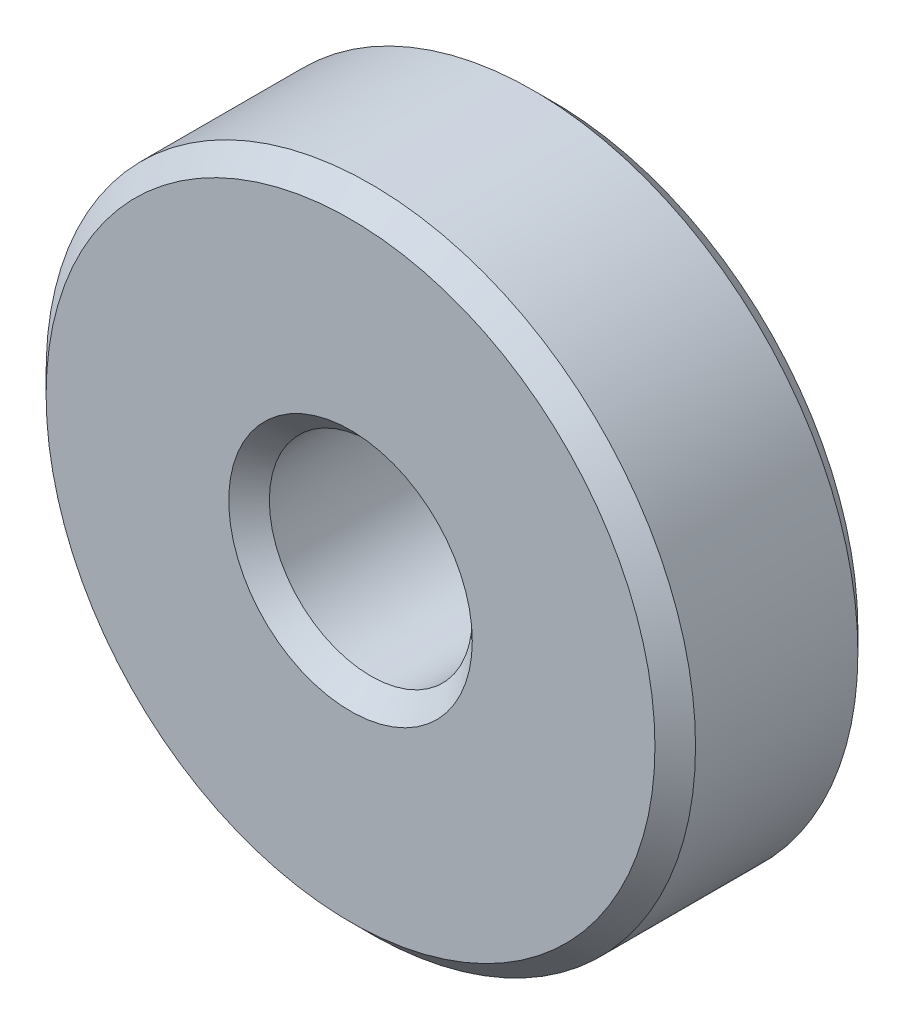
ISO-10303-21;
HEADER;
FILE_DESCRIPTION(('STEP AP214'),'2;1');
FILE_NAME('part.step','',(''),(''),'','','');
FILE_SCHEMA(('AUTOMOTIVE_DESIGN { 1 0 10303 214 1 1 1 1 }'));
ENDSEC;
DATA;
#1=APPLICATION_CONTEXT('core data for automotive mechanical design processes');
#2=APPLICATION_PROTOCOL_DEFINITION('international standard','automotive_design',2000,#1);
#3=PRODUCT_CONTEXT('',#1,'mechanical');
#4=PRODUCT('Part','Part','',(#3));
#5=PRODUCT_RELATED_PRODUCT_CATEGORY('part','',(#4));
#6=PRODUCT_DEFINITION_FORMATION('','',#4);
#7=PRODUCT_DEFINITION_CONTEXT('part definition',#1,'design');
#8=PRODUCT_DEFINITION('design','',#6,#7);
#9=PRODUCT_DEFINITION_SHAPE('','',#8);
#10=(LENGTH_UNIT() NAMED_UNIT(*) SI_UNIT(.MILLI.,.METRE.));
#11=(NAMED_UNIT(*) PLANE_ANGLE_UNIT() SI_UNIT($,.RADIAN.));
#12=(NAMED_UNIT(*) SI_UNIT($,.STERADIAN.) SOLID_ANGLE_UNIT());
#13=UNCERTAINTY_MEASURE_WITH_UNIT(LENGTH_MEASURE(1.E-05),#10,'distance_accuracy_value','');
#14=(GEOMETRIC_REPRESENTATION_CONTEXT(3) GLOBAL_UNCERTAINTY_ASSIGNED_CONTEXT((#13)) GLOBAL_UNIT_ASSIGNED_CONTEXT((#10,
#11,#12)) REPRESENTATION_CONTEXT('',''));
#15=CARTESIAN_POINT('',(0.,0.,0.));
#16=DIRECTION('',(0.,0.,1.));
#17=DIRECTION('',(1.,0.,0.));
#18=AXIS2_PLACEMENT_3D('',#15,#16,#17);
#19=CARTESIAN_POINT('',(0.,0.,5.));
#20=DIRECTION('',(0.,0.,1.));
#21=DIRECTION('',(1.,0.,0.));
#22=AXIS2_PLACEMENT_3D('',#19,#20,#21);
#23=PLANE('',#22);
#24=CARTESIAN_POINT('',(0.,0.,5.));
#25=DIRECTION('',(0.,0.,1.));
#26=DIRECTION('',(1.,0.,0.));
#27=AXIS2_PLACEMENT_3D('',#24,#25,#26);
#28=CIRCLE('',#27,3.00000000000001);
#29=CARTESIAN_POINT('',(3.00000000000001,0.,5.));
#30=VERTEX_POINT('',#29);
#31=EDGE_CURVE('E10',#30,#30,#28,.F.);
#32=ORIENTED_EDGE('',*,*,#31,.T.);
#33=EDGE_LOOP('',(#32));
#34=FACE_BOUND('',#33,.T.);
#35=CARTESIAN_POINT('',(0.,0.,5.));
#36=DIRECTION('',(0.,0.,1.));
#37=DIRECTION('',(1.,0.,0.));
#38=AXIS2_PLACEMENT_3D('',#35,#36,#37);
#39=CIRCLE('',#38,7.5);
#40=CARTESIAN_POINT('',(7.5,0.,5.));
#41=VERTEX_POINT('',#40);
#42=EDGE_CURVE('E38',#41,#41,#39,.T.);
#43=ORIENTED_EDGE('',*,*,#42,.T.);
#44=EDGE_LOOP('',(#43));
#45=FACE_BOUND('',#44,.T.);
#46=ADVANCED_FACE('F31',(#34,#45),#23,.T.);
#47=CARTESIAN_POINT('',(0.,0.,0.));
#48=DIRECTION('',(0.,0.,1.));
#49=DIRECTION('',(1.,0.,0.));
#50=AXIS2_PLACEMENT_3D('',#47,#48,#49);
#51=PLANE('',#50);
#52=CARTESIAN_POINT('',(0.,0.,0.));
#53=DIRECTION('',(0.,0.,1.));
#54=DIRECTION('',(1.,0.,0.));
#55=AXIS2_PLACEMENT_3D('',#52,#53,#54);
#56=CIRCLE('',#55,3.);
#57=CARTESIAN_POINT('',(3.,0.,0.));
#58=VERTEX_POINT('',#57);
#59=EDGE_CURVE('E57',#58,#58,#56,.T.);
#60=ORIENTED_EDGE('',*,*,#59,.T.);
#61=EDGE_LOOP('',(#60));
#62=FACE_BOUND('',#61,.T.);
#63=CARTESIAN_POINT('',(0.,0.,0.));
#64=DIRECTION('',(0.,0.,1.));
#65=DIRECTION('',(1.,0.,0.));
#66=AXIS2_PLACEMENT_3D('',#63,#64,#65);
#67=CIRCLE('',#66,7.49999999999999);
#68=CARTESIAN_POINT('',(7.49999999999999,0.,0.));
#69=VERTEX_POINT('',#68);
#70=EDGE_CURVE('E60',#69,#69,#67,.F.);
#71=ORIENTED_EDGE('',*,*,#70,.T.);
#72=EDGE_LOOP('',(#71));
#73=FACE_BOUND('',#72,.T.);
#74=ADVANCED_FACE('F64',(#62,#73),#51,.F.);
#75=CARTESIAN_POINT('',(0.,0.,5.));
#76=DIRECTION('',(0.,0.,-1.));
#77=DIRECTION('',(-1.,0.,0.));
#78=AXIS2_PLACEMENT_3D('',#75,#76,#77);
#79=CYLINDRICAL_SURFACE('',#78,8.);
#80=CARTESIAN_POINT('',(0.,0.,0.500000000000004));
#81=DIRECTION('',(0.,0.,1.));
#82=DIRECTION('',(1.,0.,0.));
#83=AXIS2_PLACEMENT_3D('',#80,#81,#82);
#84=CIRCLE('',#83,8.);
#85=CARTESIAN_POINT('',(8.,0.,0.500000000000004));
#86=VERTEX_POINT('',#85);
#87=EDGE_CURVE('E42',#86,#86,#84,.T.);
#88=ORIENTED_EDGE('',*,*,#87,.T.);
#89=EDGE_LOOP('',(#88));
#90=FACE_BOUND('',#89,.T.);
#91=CARTESIAN_POINT('',(0.,0.,4.5));
#92=DIRECTION('',(0.,0.,1.));
#93=DIRECTION('',(1.,0.,0.));
#94=AXIS2_PLACEMENT_3D('',#91,#92,#93);
#95=CIRCLE('',#94,8.);
#96=CARTESIAN_POINT('',(8.,0.,4.5));
#97=VERTEX_POINT('',#96);
#98=EDGE_CURVE('E46',#97,#97,#95,.F.);
#99=ORIENTED_EDGE('',*,*,#98,.T.);
#100=EDGE_LOOP('',(#99));
#101=FACE_BOUND('',#100,.T.);
#102=ADVANCED_FACE('F74',(#90,#101),#79,.T.);
#103=CARTESIAN_POINT('',(0.,0.,5.));
#104=DIRECTION('',(0.,0.,-1.));
#105=DIRECTION('',(-1.,0.,0.));
#106=AXIS2_PLACEMENT_3D('',#103,#104,#105);
#107=CYLINDRICAL_SURFACE('',#106,2.5);
#108=CARTESIAN_POINT('',(0.,0.,0.500000000000005));
#109=DIRECTION('',(0.,0.,1.));
#110=DIRECTION('',(1.,0.,0.));
#111=AXIS2_PLACEMENT_3D('',#108,#109,#110);
#112=CIRCLE('',#111,2.5);
#113=CARTESIAN_POINT('',(2.5,0.,0.500000000000005));
#114=VERTEX_POINT('',#113);
#115=EDGE_CURVE('E51',#114,#114,#112,.F.);
#116=ORIENTED_EDGE('',*,*,#115,.T.);
#117=EDGE_LOOP('',(#116));
#118=FACE_BOUND('',#117,.T.);
#119=CARTESIAN_POINT('',(0.,0.,4.5));
#120=DIRECTION('',(0.,0.,1.));
#121=DIRECTION('',(1.,0.,0.));
#122=AXIS2_PLACEMENT_3D('',#119,#120,#121);
#123=CIRCLE('',#122,2.5);
#124=CARTESIAN_POINT('',(2.5,0.,4.5));
#125=VERTEX_POINT('',#124);
#126=EDGE_CURVE('E54',#125,#125,#123,.T.);
#127=ORIENTED_EDGE('',*,*,#126,.T.);
#128=EDGE_LOOP('',(#127));
#129=FACE_BOUND('',#128,.T.);
#130=ADVANCED_FACE('F77',(#118,#129),#107,.F.);
#131=CARTESIAN_POINT('',(0.,0.,0.));
#132=DIRECTION('',(0.,0.,-1.));
#133=DIRECTION('',(-1.,0.,0.));
#134=AXIS2_PLACEMENT_3D('',#131,#132,#133);
#135=CONICAL_SURFACE('',#134,3.,0.785398163397445);
#136=ORIENTED_EDGE('',*,*,#115,.F.);
#137=EDGE_LOOP('',(#136));
#138=FACE_BOUND('',#137,.T.);
#139=ORIENTED_EDGE('',*,*,#59,.F.);
#140=EDGE_LOOP('',(#139));
#141=FACE_BOUND('',#140,.T.);
#142=ADVANCED_FACE('F70',(#138,#141),#135,.F.);
#143=CARTESIAN_POINT('',(0.,0.,0.500000000000004));
#144=DIRECTION('',(0.,0.,1.));
#145=DIRECTION('',(1.,0.,0.));
#146=AXIS2_PLACEMENT_3D('',#143,#144,#145);
#147=CONICAL_SURFACE('',#146,8.,0.78539816339745);
#148=ORIENTED_EDGE('',*,*,#70,.F.);
#149=EDGE_LOOP('',(#148));
#150=FACE_BOUND('',#149,.T.);
#151=ORIENTED_EDGE('',*,*,#87,.F.);
#152=EDGE_LOOP('',(#151));
#153=FACE_BOUND('',#152,.T.);
#154=ADVANCED_FACE('F66',(#150,#153),#147,.T.);
#155=CARTESIAN_POINT('',(0.,0.,4.5));
#156=DIRECTION('',(0.,0.,1.));
#157=DIRECTION('',(1.,0.,0.));
#158=AXIS2_PLACEMENT_3D('',#155,#156,#157);
#159=CONICAL_SURFACE('',#158,2.5,0.785398163397454);
#160=ORIENTED_EDGE('',*,*,#31,.F.);
#161=EDGE_LOOP('',(#160));
#162=FACE_BOUND('',#161,.T.);
#163=ORIENTED_EDGE('',*,*,#126,.F.);
#164=EDGE_LOOP('',(#163));
#165=FACE_BOUND('',#164,.T.);
#166=ADVANCED_FACE('F69',(#162,#165),#159,.F.);
#167=CARTESIAN_POINT('',(0.,0.,5.));
#168=DIRECTION('',(0.,0.,-1.));
#169=DIRECTION('',(-1.,0.,0.));
#170=AXIS2_PLACEMENT_3D('',#167,#168,#169);
#171=CONICAL_SURFACE('',#170,7.5,0.785398163397448);
#172=ORIENTED_EDGE('',*,*,#98,.F.);
#173=EDGE_LOOP('',(#172));
#174=FACE_BOUND('',#173,.T.);
#175=ORIENTED_EDGE('',*,*,#42,.F.);
#176=EDGE_LOOP('',(#175));
#177=FACE_BOUND('',#176,.T.);
#178=ADVANCED_FACE('F33',(#174,#177),#171,.T.);
#179=CLOSED_SHELL('',(#46,#74,#102,#130,#142,#154,#166,#178));
#180=MANIFOLD_SOLID_BREP('B2',#179);
#181=ADVANCED_BREP_SHAPE_REPRESENTATION('',(#18,#180),#14);
#182=SHAPE_DEFINITION_REPRESENTATION(#9,#181);
ENDSEC;
END-ISO-10303-21;
